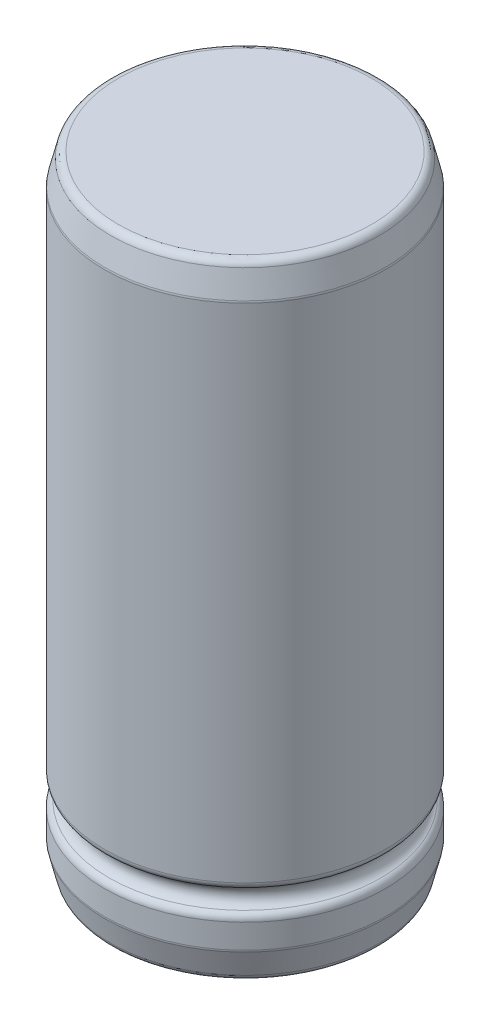
ISO-10303-21;
HEADER;
FILE_DESCRIPTION(('STEP AP214'),'2;1');
FILE_NAME('part.step','',(''),(''),'','','');
FILE_SCHEMA(('AUTOMOTIVE_DESIGN { 1 0 10303 214 1 1 1 1 }'));
ENDSEC;
DATA;
#1=APPLICATION_CONTEXT('core data for automotive mechanical design processes');
#2=APPLICATION_PROTOCOL_DEFINITION('international standard','automotive_design',2000,#1);
#3=PRODUCT_CONTEXT('',#1,'mechanical');
#4=PRODUCT('Part','Part','',(#3));
#5=PRODUCT_RELATED_PRODUCT_CATEGORY('part','',(#4));
#6=PRODUCT_DEFINITION_FORMATION('','',#4);
#7=PRODUCT_DEFINITION_CONTEXT('part definition',#1,'design');
#8=PRODUCT_DEFINITION('design','',#6,#7);
#9=PRODUCT_DEFINITION_SHAPE('','',#8);
#10=(LENGTH_UNIT() NAMED_UNIT(*) SI_UNIT(.MILLI.,.METRE.));
#11=(NAMED_UNIT(*) PLANE_ANGLE_UNIT() SI_UNIT($,.RADIAN.));
#12=(NAMED_UNIT(*) SI_UNIT($,.STERADIAN.) SOLID_ANGLE_UNIT());
#13=UNCERTAINTY_MEASURE_WITH_UNIT(LENGTH_MEASURE(1.E-05),#10,'distance_accuracy_value','');
#14=(GEOMETRIC_REPRESENTATION_CONTEXT(3) GLOBAL_UNCERTAINTY_ASSIGNED_CONTEXT((#13)) GLOBAL_UNIT_ASSIGNED_CONTEXT((#10,
#11,#12)) REPRESENTATION_CONTEXT('',''));
#15=CARTESIAN_POINT('',(0.,0.,0.));
#16=DIRECTION('',(0.,0.,1.));
#17=DIRECTION('',(1.,0.,0.));
#18=AXIS2_PLACEMENT_3D('',#15,#16,#17);
#19=CARTESIAN_POINT('',(3.75,-3.,0.));
#20=DIRECTION('',(0.,1.,0.));
#21=DIRECTION('',(0.,0.,1.));
#22=AXIS2_PLACEMENT_3D('',#19,#20,#21);
#23=CYLINDRICAL_SURFACE('',#22,0.4);
#24=CARTESIAN_POINT('',(3.75,-3.,0.));
#25=DIRECTION('',(0.,-1.,0.));
#26=DIRECTION('',(0.,0.,-1.));
#27=AXIS2_PLACEMENT_3D('',#24,#25,#26);
#28=CIRCLE('',#27,0.4);
#29=CARTESIAN_POINT('',(3.75,-3.,-0.4));
#30=VERTEX_POINT('',#29);
#31=EDGE_CURVE('E11',#30,#30,#28,.T.);
#32=ORIENTED_EDGE('',*,*,#31,.F.);
#33=EDGE_LOOP('',(#32));
#34=FACE_BOUND('',#33,.T.);
#35=CARTESIAN_POINT('',(3.75,0.,0.));
#36=DIRECTION('',(0.,-1.,0.));
#37=DIRECTION('',(0.,0.,-1.));
#38=AXIS2_PLACEMENT_3D('',#35,#36,#37);
#39=CIRCLE('',#38,0.4);
#40=CARTESIAN_POINT('',(3.75,0.,-0.4));
#41=VERTEX_POINT('',#40);
#42=EDGE_CURVE('E49',#41,#41,#39,.T.);
#43=ORIENTED_EDGE('',*,*,#42,.T.);
#44=EDGE_LOOP('',(#43));
#45=FACE_BOUND('',#44,.T.);
#46=ADVANCED_FACE('F46',(#34,#45),#23,.T.);
#47=CARTESIAN_POINT('',(3.75,-3.,0.));
#48=DIRECTION('',(0.,-1.,0.));
#49=DIRECTION('',(0.,0.,-1.));
#50=AXIS2_PLACEMENT_3D('',#47,#48,#49);
#51=PLANE('',#50);
#52=ORIENTED_EDGE('',*,*,#31,.T.);
#53=EDGE_LOOP('',(#52));
#54=FACE_BOUND('',#53,.T.);
#55=ADVANCED_FACE('F61',(#54),#51,.T.);
#56=CARTESIAN_POINT('',(3.75,0.,0.));
#57=DIRECTION('',(0.,-1.,0.));
#58=DIRECTION('',(0.,0.,-1.));
#59=AXIS2_PLACEMENT_3D('',#56,#57,#58);
#60=PLANE('',#59);
#61=ORIENTED_EDGE('',*,*,#42,.F.);
#62=EDGE_LOOP('',(#61));
#63=FACE_BOUND('',#62,.T.);
#64=ADVANCED_FACE('F59',(#63),#60,.F.);
#65=CLOSED_SHELL('',(#46,#55,#64));
#66=MANIFOLD_SOLID_BREP('B2',#65);
#67=CARTESIAN_POINT('',(-3.75,-3.,0.));
#68=DIRECTION('',(0.,1.,0.));
#69=DIRECTION('',(0.,0.,1.));
#70=AXIS2_PLACEMENT_3D('',#67,#68,#69);
#71=CYLINDRICAL_SURFACE('',#70,0.4);
#72=CARTESIAN_POINT('',(-3.75,-3.,0.));
#73=DIRECTION('',(0.,-1.,0.));
#74=DIRECTION('',(0.,0.,-1.));
#75=AXIS2_PLACEMENT_3D('',#72,#73,#74);
#76=CIRCLE('',#75,0.4);
#77=CARTESIAN_POINT('',(-3.75,-3.,-0.4));
#78=VERTEX_POINT('',#77);
#79=EDGE_CURVE('E45',#78,#78,#76,.T.);
#80=ORIENTED_EDGE('',*,*,#79,.F.);
#81=EDGE_LOOP('',(#80));
#82=FACE_BOUND('',#81,.T.);
#83=CARTESIAN_POINT('',(-3.75,0.,0.));
#84=DIRECTION('',(0.,-1.,0.));
#85=DIRECTION('',(0.,0.,-1.));
#86=AXIS2_PLACEMENT_3D('',#83,#84,#85);
#87=CIRCLE('',#86,0.4);
#88=CARTESIAN_POINT('',(-3.75,0.,-0.4));
#89=VERTEX_POINT('',#88);
#90=EDGE_CURVE('E97',#89,#89,#87,.T.);
#91=ORIENTED_EDGE('',*,*,#90,.T.);
#92=EDGE_LOOP('',(#91));
#93=FACE_BOUND('',#92,.T.);
#94=ADVANCED_FACE('F94',(#82,#93),#71,.T.);
#95=CARTESIAN_POINT('',(-3.75,-3.,0.));
#96=DIRECTION('',(0.,-1.,0.));
#97=DIRECTION('',(0.,0.,-1.));
#98=AXIS2_PLACEMENT_3D('',#95,#96,#97);
#99=PLANE('',#98);
#100=ORIENTED_EDGE('',*,*,#79,.T.);
#101=EDGE_LOOP('',(#100));
#102=FACE_BOUND('',#101,.T.);
#103=ADVANCED_FACE('F109',(#102),#99,.T.);
#104=CARTESIAN_POINT('',(-3.75,0.,0.));
#105=DIRECTION('',(0.,-1.,0.));
#106=DIRECTION('',(0.,0.,-1.));
#107=AXIS2_PLACEMENT_3D('',#104,#105,#106);
#108=PLANE('',#107);
#109=ORIENTED_EDGE('',*,*,#90,.F.);
#110=EDGE_LOOP('',(#109));
#111=FACE_BOUND('',#110,.T.);
#112=ADVANCED_FACE('F107',(#111),#108,.F.);
#113=CLOSED_SHELL('',(#94,#103,#112));
#114=MANIFOLD_SOLID_BREP('B6',#113);
#115=CARTESIAN_POINT('',(8.5,0.,0.));
#116=DIRECTION('',(0.,-1.,0.));
#117=DIRECTION('',(0.,0.,-1.));
#118=AXIS2_PLACEMENT_3D('',#115,#116,#117);
#119=PLANE('',#118);
#120=CARTESIAN_POINT('',(0.,0.,0.));
#121=DIRECTION('',(0.,-1.,0.));
#122=DIRECTION('',(0.,0.,-1.));
#123=AXIS2_PLACEMENT_3D('',#120,#121,#122);
#124=CIRCLE('',#123,8.10961179679779);
#125=CARTESIAN_POINT('',(0.,0.,-8.10961179679779));
#126=VERTEX_POINT('',#125);
#127=EDGE_CURVE('E146',#126,#126,#124,.T.);
#128=ORIENTED_EDGE('',*,*,#127,.T.);
#129=EDGE_LOOP('',(#128));
#130=FACE_BOUND('',#129,.T.);
#131=ADVANCED_FACE('F135',(#130),#119,.T.);
#132=CARTESIAN_POINT('',(0.,0.,0.));
#133=DIRECTION('',(0.,1.,0.));
#134=DIRECTION('',(0.,0.,1.));
#135=AXIS2_PLACEMENT_3D('',#132,#133,#134);
#136=CONICAL_SURFACE('',#135,8.5,0.244978663126864);
#137=CARTESIAN_POINT('',(0.,0.378732187481835,0.));
#138=DIRECTION('',(0.,-1.,0.));
#139=DIRECTION('',(0.,0.,-1.));
#140=AXIS2_PLACEMENT_3D('',#137,#138,#139);
#141=CIRCLE('',#140,8.59468304687046);
#142=CARTESIAN_POINT('',(0.,0.378732187481835,-8.59468304687046));
#143=VERTEX_POINT('',#142);
#144=EDGE_CURVE('E93',#143,#143,#141,.F.);
#145=ORIENTED_EDGE('',*,*,#144,.T.);
#146=EDGE_LOOP('',(#145));
#147=FACE_BOUND('',#146,.T.);
#148=CARTESIAN_POINT('',(0.,1.94028500029066,0.));
#149=DIRECTION('',(0.,-1.,0.));
#150=DIRECTION('',(0.,0.,-1.));
#151=AXIS2_PLACEMENT_3D('',#148,#149,#150);
#152=CIRCLE('',#151,8.98507125007267);
#153=CARTESIAN_POINT('',(0.,1.94028500029066,-8.98507125007267));
#154=VERTEX_POINT('',#153);
#155=EDGE_CURVE('E142',#154,#154,#152,.T.);
#156=ORIENTED_EDGE('',*,*,#155,.T.);
#157=EDGE_LOOP('',(#156));
#158=FACE_BOUND('',#157,.T.);
#159=ADVANCED_FACE('F191',(#147,#158),#136,.T.);
#160=CARTESIAN_POINT('',(0.,0.,0.));
#161=DIRECTION('',(0.,-1.,0.));
#162=DIRECTION('',(0.,0.,-1.));
#163=AXIS2_PLACEMENT_3D('',#160,#161,#162);
#164=CYLINDRICAL_SURFACE('',#163,9.);
#165=CARTESIAN_POINT('',(0.,3.60912878853643,0.));
#166=DIRECTION('',(0.,1.,0.));
#167=DIRECTION('',(0.,0.,1.));
#168=AXIS2_PLACEMENT_3D('',#165,#166,#167);
#169=CIRCLE('',#168,9.);
#170=CARTESIAN_POINT('',(0.,3.60912878853643,9.));
#171=VERTEX_POINT('',#170);
#172=EDGE_CURVE('E173',#171,#171,#169,.F.);
#173=ORIENTED_EDGE('',*,*,#172,.T.);
#174=EDGE_LOOP('',(#173));
#175=FACE_BOUND('',#174,.T.);
#176=CARTESIAN_POINT('',(0.,2.06155281280883,0.));
#177=DIRECTION('',(0.,1.,0.));
#178=DIRECTION('',(0.,0.,1.));
#179=AXIS2_PLACEMENT_3D('',#176,#177,#178);
#180=CIRCLE('',#179,9.);
#181=CARTESIAN_POINT('',(0.,2.06155281280883,9.));
#182=VERTEX_POINT('',#181);
#183=EDGE_CURVE('E176',#182,#182,#180,.T.);
#184=ORIENTED_EDGE('',*,*,#183,.T.);
#185=EDGE_LOOP('',(#184));
#186=FACE_BOUND('',#185,.T.);
#187=ADVANCED_FACE('F180',(#175,#186),#164,.T.);
#188=CARTESIAN_POINT('',(0.,4.7,0.));
#189=DIRECTION('',(0.,-1.,0.));
#190=DIRECTION('',(0.,0.,-1.));
#191=AXIS2_PLACEMENT_3D('',#188,#189,#190);
#192=TOROIDAL_SURFACE('',#191,9.00000000000001,0.7);
#193=CARTESIAN_POINT('',(0.,4.06365845997955,0.));
#194=DIRECTION('',(0.,1.,0.));
#195=DIRECTION('',(0.,0.,1.));
#196=AXIS2_PLACEMENT_3D('',#193,#194,#195);
#197=CIRCLE('',#196,8.70833333333332);
#198=CARTESIAN_POINT('',(0.,4.06365845997955,8.70833333333332));
#199=VERTEX_POINT('',#198);
#200=EDGE_CURVE('E167',#199,#199,#197,.T.);
#201=ORIENTED_EDGE('',*,*,#200,.T.);
#202=EDGE_LOOP('',(#201));
#203=FACE_BOUND('',#202,.T.);
#204=CARTESIAN_POINT('',(0.,5.33634154002045,0.));
#205=DIRECTION('',(0.,-1.,0.));
#206=DIRECTION('',(0.,0.,-1.));
#207=AXIS2_PLACEMENT_3D('',#204,#205,#206);
#208=CIRCLE('',#207,8.70833333333332);
#209=CARTESIAN_POINT('',(0.,5.33634154002045,-8.70833333333332));
#210=VERTEX_POINT('',#209);
#211=EDGE_CURVE('E170',#210,#210,#208,.T.);
#212=ORIENTED_EDGE('',*,*,#211,.T.);
#213=EDGE_LOOP('',(#212));
#214=FACE_BOUND('',#213,.T.);
#215=ADVANCED_FACE('F232',(#203,#214),#192,.F.);
#216=CARTESIAN_POINT('',(0.,0.,0.));
#217=DIRECTION('',(0.,-1.,0.));
#218=DIRECTION('',(0.,0.,-1.));
#219=AXIS2_PLACEMENT_3D('',#216,#217,#218);
#220=CYLINDRICAL_SURFACE('',#219,9.);
#221=CARTESIAN_POINT('',(0.,5.79087121146357,0.));
#222=DIRECTION('',(0.,1.,0.));
#223=DIRECTION('',(0.,0.,1.));
#224=AXIS2_PLACEMENT_3D('',#221,#222,#223);
#225=CIRCLE('',#224,9.);
#226=CARTESIAN_POINT('',(0.,5.79087121146357,9.));
#227=VERTEX_POINT('',#226);
#228=EDGE_CURVE('E161',#227,#227,#225,.T.);
#229=ORIENTED_EDGE('',*,*,#228,.T.);
#230=EDGE_LOOP('',(#229));
#231=FACE_BOUND('',#230,.T.);
#232=CARTESIAN_POINT('',(0.,37.9384471871912,0.));
#233=DIRECTION('',(0.,1.,0.));
#234=DIRECTION('',(0.,0.,1.));
#235=AXIS2_PLACEMENT_3D('',#232,#233,#234);
#236=CIRCLE('',#235,9.);
#237=CARTESIAN_POINT('',(0.,37.9384471871912,9.));
#238=VERTEX_POINT('',#237);
#239=EDGE_CURVE('E164',#238,#238,#236,.F.);
#240=ORIENTED_EDGE('',*,*,#239,.T.);
#241=EDGE_LOOP('',(#240));
#242=FACE_BOUND('',#241,.T.);
#243=ADVANCED_FACE('F223',(#231,#242),#220,.T.);
#244=CARTESIAN_POINT('',(0.,38.,0.));
#245=DIRECTION('',(0.,-1.,0.));
#246=DIRECTION('',(0.,0.,-1.));
#247=AXIS2_PLACEMENT_3D('',#244,#245,#246);
#248=CONICAL_SURFACE('',#247,9.,0.244978663126863);
#249=CARTESIAN_POINT('',(0.,38.0597149997093,0.));
#250=DIRECTION('',(0.,1.,0.));
#251=DIRECTION('',(0.,0.,1.));
#252=AXIS2_PLACEMENT_3D('',#249,#250,#251);
#253=CIRCLE('',#252,8.98507125007267);
#254=CARTESIAN_POINT('',(0.,38.0597149997093,8.98507125007267));
#255=VERTEX_POINT('',#254);
#256=EDGE_CURVE('E155',#255,#255,#253,.T.);
#257=ORIENTED_EDGE('',*,*,#256,.T.);
#258=EDGE_LOOP('',(#257));
#259=FACE_BOUND('',#258,.T.);
#260=CARTESIAN_POINT('',(0.,39.6212678125182,0.));
#261=DIRECTION('',(0.,1.,0.));
#262=DIRECTION('',(0.,0.,1.));
#263=AXIS2_PLACEMENT_3D('',#260,#261,#262);
#264=CIRCLE('',#263,8.59468304687046);
#265=CARTESIAN_POINT('',(0.,39.6212678125182,8.59468304687046));
#266=VERTEX_POINT('',#265);
#267=EDGE_CURVE('E158',#266,#266,#264,.F.);
#268=ORIENTED_EDGE('',*,*,#267,.T.);
#269=EDGE_LOOP('',(#268));
#270=FACE_BOUND('',#269,.T.);
#271=ADVANCED_FACE('F221',(#259,#270),#248,.T.);
#272=CARTESIAN_POINT('',(0.,40.,0.));
#273=DIRECTION('',(0.,1.,0.));
#274=DIRECTION('',(0.,0.,1.));
#275=AXIS2_PLACEMENT_3D('',#272,#273,#274);
#276=PLANE('',#275);
#277=CARTESIAN_POINT('',(0.,40.,0.));
#278=DIRECTION('',(0.,1.,0.));
#279=DIRECTION('',(0.,0.,1.));
#280=AXIS2_PLACEMENT_3D('',#277,#278,#279);
#281=CIRCLE('',#280,8.10961179679779);
#282=CARTESIAN_POINT('',(0.,40.,8.10961179679779));
#283=VERTEX_POINT('',#282);
#284=EDGE_CURVE('E150',#283,#283,#281,.T.);
#285=ORIENTED_EDGE('',*,*,#284,.T.);
#286=EDGE_LOOP('',(#285));
#287=FACE_BOUND('',#286,.T.);
#288=ADVANCED_FACE('F204',(#287),#276,.T.);
#289=CARTESIAN_POINT('',(0.,3.60912878853643,0.));
#290=DIRECTION('',(0.,1.,0.));
#291=DIRECTION('',(0.,0.,1.));
#292=AXIS2_PLACEMENT_3D('',#289,#290,#291);
#293=TOROIDAL_SURFACE('',#292,8.5,0.5);
#294=ORIENTED_EDGE('',*,*,#200,.F.);
#295=EDGE_LOOP('',(#294));
#296=FACE_BOUND('',#295,.T.);
#297=ORIENTED_EDGE('',*,*,#172,.F.);
#298=EDGE_LOOP('',(#297));
#299=FACE_BOUND('',#298,.T.);
#300=ADVANCED_FACE('F200',(#296,#299),#293,.T.);
#301=CARTESIAN_POINT('',(0.,5.79087121146357,0.));
#302=DIRECTION('',(0.,1.,0.));
#303=DIRECTION('',(0.,0.,1.));
#304=AXIS2_PLACEMENT_3D('',#301,#302,#303);
#305=TOROIDAL_SURFACE('',#304,8.5,0.5);
#306=ORIENTED_EDGE('',*,*,#228,.F.);
#307=EDGE_LOOP('',(#306));
#308=FACE_BOUND('',#307,.T.);
#309=ORIENTED_EDGE('',*,*,#211,.F.);
#310=EDGE_LOOP('',(#309));
#311=FACE_BOUND('',#310,.T.);
#312=ADVANCED_FACE('F203',(#308,#311),#305,.T.);
#313=CARTESIAN_POINT('',(0.,37.9384471871912,0.));
#314=DIRECTION('',(0.,1.,0.));
#315=DIRECTION('',(0.,0.,1.));
#316=AXIS2_PLACEMENT_3D('',#313,#314,#315);
#317=TOROIDAL_SURFACE('',#316,8.5,0.5);
#318=ORIENTED_EDGE('',*,*,#256,.F.);
#319=EDGE_LOOP('',(#318));
#320=FACE_BOUND('',#319,.T.);
#321=ORIENTED_EDGE('',*,*,#239,.F.);
#322=EDGE_LOOP('',(#321));
#323=FACE_BOUND('',#322,.T.);
#324=ADVANCED_FACE('F208',(#320,#323),#317,.T.);
#325=CARTESIAN_POINT('',(0.,39.5,0.));
#326=DIRECTION('',(0.,1.,0.));
#327=DIRECTION('',(0.,0.,1.));
#328=AXIS2_PLACEMENT_3D('',#325,#326,#327);
#329=TOROIDAL_SURFACE('',#328,8.10961179679779,0.5);
#330=ORIENTED_EDGE('',*,*,#284,.F.);
#331=EDGE_LOOP('',(#330));
#332=FACE_BOUND('',#331,.T.);
#333=ORIENTED_EDGE('',*,*,#267,.F.);
#334=EDGE_LOOP('',(#333));
#335=FACE_BOUND('',#334,.T.);
#336=ADVANCED_FACE('F188',(#332,#335),#329,.T.);
#337=CARTESIAN_POINT('',(0.,0.5,0.));
#338=DIRECTION('',(0.,-1.,0.));
#339=DIRECTION('',(0.,0.,-1.));
#340=AXIS2_PLACEMENT_3D('',#337,#338,#339);
#341=TOROIDAL_SURFACE('',#340,8.10961179679779,0.5);
#342=ORIENTED_EDGE('',*,*,#144,.F.);
#343=EDGE_LOOP('',(#342));
#344=FACE_BOUND('',#343,.T.);
#345=ORIENTED_EDGE('',*,*,#127,.F.);
#346=EDGE_LOOP('',(#345));
#347=FACE_BOUND('',#346,.T.);
#348=ADVANCED_FACE('F184',(#344,#347),#341,.T.);
#349=CARTESIAN_POINT('',(0.,2.06155281280883,0.));
#350=DIRECTION('',(0.,1.,0.));
#351=DIRECTION('',(0.,0.,1.));
#352=AXIS2_PLACEMENT_3D('',#349,#350,#351);
#353=TOROIDAL_SURFACE('',#352,8.5,0.5);
#354=ORIENTED_EDGE('',*,*,#183,.F.);
#355=EDGE_LOOP('',(#354));
#356=FACE_BOUND('',#355,.T.);
#357=ORIENTED_EDGE('',*,*,#155,.F.);
#358=EDGE_LOOP('',(#357));
#359=FACE_BOUND('',#358,.T.);
#360=ADVANCED_FACE('F137',(#356,#359),#353,.T.);
#361=CLOSED_SHELL('',(#131,#159,#187,#215,#243,#271,#288,#300,#312,#324,#336,#348,#360));
#362=MANIFOLD_SOLID_BREP('B40',#361);
#363=ADVANCED_BREP_SHAPE_REPRESENTATION('',(#18,#66,#114,#362),#14);
#364=SHAPE_DEFINITION_REPRESENTATION(#9,#363);
ENDSEC;
END-ISO-10303-21;
